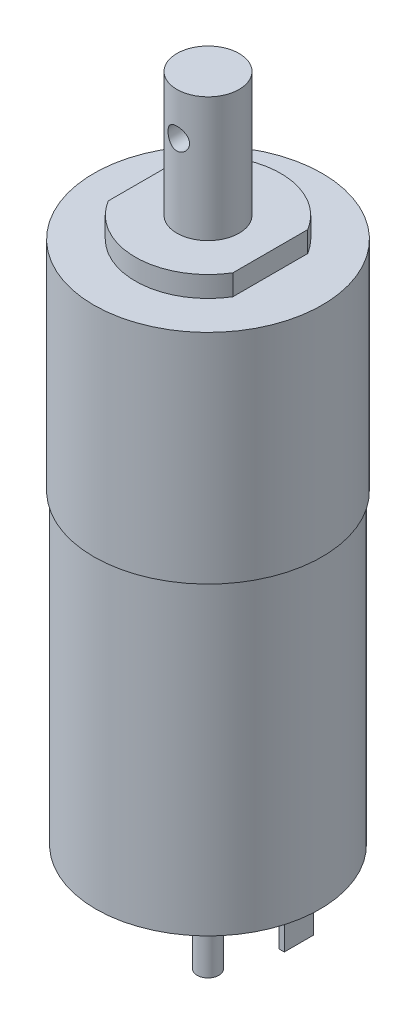
ISO-10303-21;
HEADER;
FILE_DESCRIPTION(('STEP AP214'),'2;1');
FILE_NAME('part.step','',(''),(''),'','','');
FILE_SCHEMA(('AUTOMOTIVE_DESIGN { 1 0 10303 214 1 1 1 1 }'));
ENDSEC;
DATA;
#1=APPLICATION_CONTEXT('core data for automotive mechanical design processes');
#2=APPLICATION_PROTOCOL_DEFINITION('international standard','automotive_design',2000,#1);
#3=PRODUCT_CONTEXT('',#1,'mechanical');
#4=PRODUCT('Part','Part','',(#3));
#5=PRODUCT_RELATED_PRODUCT_CATEGORY('part','',(#4));
#6=PRODUCT_DEFINITION_FORMATION('','',#4);
#7=PRODUCT_DEFINITION_CONTEXT('part definition',#1,'design');
#8=PRODUCT_DEFINITION('design','',#6,#7);
#9=PRODUCT_DEFINITION_SHAPE('','',#8);
#10=(LENGTH_UNIT() NAMED_UNIT(*) SI_UNIT(.MILLI.,.METRE.));
#11=(NAMED_UNIT(*) PLANE_ANGLE_UNIT() SI_UNIT($,.RADIAN.));
#12=(NAMED_UNIT(*) SI_UNIT($,.STERADIAN.) SOLID_ANGLE_UNIT());
#13=UNCERTAINTY_MEASURE_WITH_UNIT(LENGTH_MEASURE(1.E-05),#10,'distance_accuracy_value','');
#14=(GEOMETRIC_REPRESENTATION_CONTEXT(3) GLOBAL_UNCERTAINTY_ASSIGNED_CONTEXT((#13)) GLOBAL_UNIT_ASSIGNED_CONTEXT((#10,
#11,#12)) REPRESENTATION_CONTEXT('',''));
#15=CARTESIAN_POINT('',(0.,0.,0.));
#16=DIRECTION('',(0.,0.,1.));
#17=DIRECTION('',(1.,0.,0.));
#18=AXIS2_PLACEMENT_3D('',#15,#16,#17);
#19=CARTESIAN_POINT('',(0.,0.,0.));
#20=DIRECTION('',(0.,1.,0.));
#21=DIRECTION('',(0.,0.,1.));
#22=AXIS2_PLACEMENT_3D('',#19,#20,#21);
#23=PLANE('',#22);
#24=DIRECTION('',(0.,0.,-1.));
#25=VECTOR('',#24,1.);
#26=CARTESIAN_POINT('',(-8.75,0.,1.4));
#27=LINE('',#26,#25);
#28=CARTESIAN_POINT('',(-8.75,0.,1.4));
#29=VERTEX_POINT('',#28);
#30=CARTESIAN_POINT('',(-8.75,0.,-1.4));
#31=VERTEX_POINT('',#30);
#32=EDGE_CURVE('E159',#29,#31,#27,.T.);
#33=ORIENTED_EDGE('',*,*,#32,.F.);
#34=DIRECTION('',(-1.,0.,0.));
#35=VECTOR('',#34,1.);
#36=CARTESIAN_POINT('',(-8.75,0.,1.4));
#37=LINE('',#36,#35);
#38=CARTESIAN_POINT('',(-8.25,0.,1.4));
#39=VERTEX_POINT('',#38);
#40=EDGE_CURVE('E175',#39,#29,#37,.T.);
#41=ORIENTED_EDGE('',*,*,#40,.F.);
#42=DIRECTION('',(0.,0.,1.));
#43=VECTOR('',#42,1.);
#44=CARTESIAN_POINT('',(-8.25,0.,1.4));
#45=LINE('',#44,#43);
#46=CARTESIAN_POINT('',(-8.25,0.,-1.4));
#47=VERTEX_POINT('',#46);
#48=EDGE_CURVE('E188',#47,#39,#45,.T.);
#49=ORIENTED_EDGE('',*,*,#48,.F.);
#50=DIRECTION('',(1.,0.,0.));
#51=VECTOR('',#50,1.);
#52=CARTESIAN_POINT('',(-8.75,0.,-1.4));
#53=LINE('',#52,#51);
#54=EDGE_CURVE('E164',#31,#47,#53,.T.);
#55=ORIENTED_EDGE('',*,*,#54,.F.);
#56=EDGE_LOOP('',(#33,#41,#49,#55));
#57=FACE_BOUND('',#56,.T.);
#58=CARTESIAN_POINT('',(0.,0.,0.));
#59=DIRECTION('',(0.,-1.,0.));
#60=DIRECTION('',(0.,0.,-1.));
#61=AXIS2_PLACEMENT_3D('',#58,#59,#60);
#62=CIRCLE('',#61,3.75);
#63=CARTESIAN_POINT('',(0.,0.,-3.75));
#64=VERTEX_POINT('',#63);
#65=EDGE_CURVE('E53',#64,#64,#62,.T.);
#66=ORIENTED_EDGE('',*,*,#65,.F.);
#67=EDGE_LOOP('',(#66));
#68=FACE_BOUND('',#67,.T.);
#69=CARTESIAN_POINT('',(0.,0.,0.));
#70=DIRECTION('',(0.,1.,0.));
#71=DIRECTION('',(0.,0.,1.));
#72=AXIS2_PLACEMENT_3D('',#69,#70,#71);
#73=CIRCLE('',#72,10.8);
#74=CARTESIAN_POINT('',(0.,0.,10.8));
#75=VERTEX_POINT('',#74);
#76=EDGE_CURVE('E276',#75,#75,#73,.T.);
#77=ORIENTED_EDGE('',*,*,#76,.F.);
#78=EDGE_LOOP('',(#77));
#79=FACE_BOUND('',#78,.T.);
#80=DIRECTION('',(0.,0.,-1.));
#81=VECTOR('',#80,1.);
#82=CARTESIAN_POINT('',(8.25,0.,1.4));
#83=LINE('',#82,#81);
#84=CARTESIAN_POINT('',(8.25,0.,1.4));
#85=VERTEX_POINT('',#84);
#86=CARTESIAN_POINT('',(8.25,0.,-1.4));
#87=VERTEX_POINT('',#86);
#88=EDGE_CURVE('E157',#85,#87,#83,.T.);
#89=ORIENTED_EDGE('',*,*,#88,.F.);
#90=DIRECTION('',(-1.,0.,0.));
#91=VECTOR('',#90,1.);
#92=CARTESIAN_POINT('',(8.25,0.,1.4));
#93=LINE('',#92,#91);
#94=CARTESIAN_POINT('',(8.75,0.,1.4));
#95=VERTEX_POINT('',#94);
#96=EDGE_CURVE('E154',#95,#85,#93,.T.);
#97=ORIENTED_EDGE('',*,*,#96,.F.);
#98=DIRECTION('',(0.,0.,1.));
#99=VECTOR('',#98,1.);
#100=CARTESIAN_POINT('',(8.75,0.,1.4));
#101=LINE('',#100,#99);
#102=CARTESIAN_POINT('',(8.75,0.,-1.4));
#103=VERTEX_POINT('',#102);
#104=EDGE_CURVE('E66',#103,#95,#101,.T.);
#105=ORIENTED_EDGE('',*,*,#104,.F.);
#106=DIRECTION('',(1.,0.,0.));
#107=VECTOR('',#106,1.);
#108=CARTESIAN_POINT('',(8.25,0.,-1.4));
#109=LINE('',#108,#107);
#110=EDGE_CURVE('E61',#87,#103,#109,.T.);
#111=ORIENTED_EDGE('',*,*,#110,.F.);
#112=EDGE_LOOP('',(#89,#97,#105,#111));
#113=FACE_BOUND('',#112,.T.);
#114=ADVANCED_FACE('F38',(#57,#68,#79,#113),#23,.F.);
#115=CARTESIAN_POINT('',(0.,29.5,0.));
#116=DIRECTION('',(0.,-1.,0.));
#117=DIRECTION('',(0.,0.,-1.));
#118=AXIS2_PLACEMENT_3D('',#115,#116,#117);
#119=CYLINDRICAL_SURFACE('',#118,10.8);
#120=CARTESIAN_POINT('',(0.,29.5,0.));
#121=DIRECTION('',(0.,1.,0.));
#122=DIRECTION('',(0.,0.,1.));
#123=AXIS2_PLACEMENT_3D('',#120,#121,#122);
#124=CIRCLE('',#123,10.8);
#125=CARTESIAN_POINT('',(0.,29.5,10.8));
#126=VERTEX_POINT('',#125);
#127=EDGE_CURVE('E226',#126,#126,#124,.T.);
#128=ORIENTED_EDGE('',*,*,#127,.F.);
#129=EDGE_LOOP('',(#128));
#130=FACE_BOUND('',#129,.T.);
#131=ORIENTED_EDGE('',*,*,#76,.T.);
#132=EDGE_LOOP('',(#131));
#133=FACE_BOUND('',#132,.T.);
#134=ADVANCED_FACE('F40',(#130,#133),#119,.T.);
#135=CARTESIAN_POINT('',(0.,50.5,0.));
#136=DIRECTION('',(0.,-1.,0.));
#137=DIRECTION('',(0.,0.,-1.));
#138=AXIS2_PLACEMENT_3D('',#135,#136,#137);
#139=CYLINDRICAL_SURFACE('',#138,11.);
#140=CARTESIAN_POINT('',(0.,50.5,0.));
#141=DIRECTION('',(0.,1.,0.));
#142=DIRECTION('',(0.,0.,1.));
#143=AXIS2_PLACEMENT_3D('',#140,#141,#142);
#144=CIRCLE('',#143,11.);
#145=CARTESIAN_POINT('',(0.,50.5,-11.));
#146=VERTEX_POINT('',#145);
#147=EDGE_CURVE('E272',#146,#146,#144,.T.);
#148=CARTESIAN_POINT('',(0.,29.5,0.));
#149=DIRECTION('',(0.,1.,0.));
#150=DIRECTION('',(0.,0.,1.));
#151=AXIS2_PLACEMENT_3D('',#148,#149,#150);
#152=CIRCLE('',#151,11.);
#153=CARTESIAN_POINT('',(0.,29.5,-11.));
#154=VERTEX_POINT('',#153);
#155=EDGE_CURVE('E271',#154,#154,#152,.T.);
#156=CARTESIAN_POINT('',(0.,50.5,-11.));
#157=CARTESIAN_POINT('',(0.,50.28125,-11.));
#158=CARTESIAN_POINT('',(0.,50.0625,-11.));
#159=CARTESIAN_POINT('',(0.,49.625,-11.));
#160=CARTESIAN_POINT('',(0.,49.40625,-11.));
#161=CARTESIAN_POINT('',(0.,48.96875,-11.));
#162=CARTESIAN_POINT('',(0.,48.75,-11.));
#163=CARTESIAN_POINT('',(0.,48.3125,-11.));
#164=CARTESIAN_POINT('',(0.,48.09375,-11.));
#165=CARTESIAN_POINT('',(0.,47.65625,-11.));
#166=CARTESIAN_POINT('',(0.,47.4375,-11.));
#167=CARTESIAN_POINT('',(0.,47.,-11.));
#168=CARTESIAN_POINT('',(0.,46.78125,-11.));
#169=CARTESIAN_POINT('',(0.,46.34375,-11.));
#170=CARTESIAN_POINT('',(0.,46.125,-11.));
#171=CARTESIAN_POINT('',(0.,45.6875,-11.));
#172=CARTESIAN_POINT('',(0.,45.46875,-11.));
#173=CARTESIAN_POINT('',(0.,45.03125,-11.));
#174=CARTESIAN_POINT('',(0.,44.8125,-11.));
#175=CARTESIAN_POINT('',(0.,44.375,-11.));
#176=CARTESIAN_POINT('',(0.,44.15625,-11.));
#177=CARTESIAN_POINT('',(0.,43.71875,-11.));
#178=CARTESIAN_POINT('',(0.,43.5,-11.));
#179=CARTESIAN_POINT('',(0.,43.0625,-11.));
#180=CARTESIAN_POINT('',(0.,42.84375,-11.));
#181=CARTESIAN_POINT('',(0.,42.40625,-11.));
#182=CARTESIAN_POINT('',(0.,42.1875,-11.));
#183=CARTESIAN_POINT('',(0.,41.75,-11.));
#184=CARTESIAN_POINT('',(0.,41.53125,-11.));
#185=CARTESIAN_POINT('',(0.,41.09375,-11.));
#186=CARTESIAN_POINT('',(0.,40.875,-11.));
#187=CARTESIAN_POINT('',(0.,40.4375,-11.));
#188=CARTESIAN_POINT('',(0.,40.21875,-11.));
#189=CARTESIAN_POINT('',(0.,39.78125,-11.));
#190=CARTESIAN_POINT('',(0.,39.5625,-11.));
#191=CARTESIAN_POINT('',(0.,39.125,-11.));
#192=CARTESIAN_POINT('',(0.,38.90625,-11.));
#193=CARTESIAN_POINT('',(0.,38.46875,-11.));
#194=CARTESIAN_POINT('',(0.,38.25,-11.));
#195=CARTESIAN_POINT('',(0.,37.8125,-11.));
#196=CARTESIAN_POINT('',(0.,37.59375,-11.));
#197=CARTESIAN_POINT('',(0.,37.15625,-11.));
#198=CARTESIAN_POINT('',(0.,36.9375,-11.));
#199=CARTESIAN_POINT('',(0.,36.5,-11.));
#200=CARTESIAN_POINT('',(0.,36.28125,-11.));
#201=CARTESIAN_POINT('',(0.,35.84375,-11.));
#202=CARTESIAN_POINT('',(0.,35.625,-11.));
#203=CARTESIAN_POINT('',(0.,35.1875,-11.));
#204=CARTESIAN_POINT('',(0.,34.96875,-11.));
#205=CARTESIAN_POINT('',(0.,34.53125,-11.));
#206=CARTESIAN_POINT('',(0.,34.3125,-11.));
#207=CARTESIAN_POINT('',(0.,33.875,-11.));
#208=CARTESIAN_POINT('',(0.,33.65625,-11.));
#209=CARTESIAN_POINT('',(0.,33.21875,-11.));
#210=CARTESIAN_POINT('',(0.,33.,-11.));
#211=CARTESIAN_POINT('',(0.,32.5625,-11.));
#212=CARTESIAN_POINT('',(0.,32.34375,-11.));
#213=CARTESIAN_POINT('',(0.,31.90625,-11.));
#214=CARTESIAN_POINT('',(0.,31.6875,-11.));
#215=CARTESIAN_POINT('',(0.,31.25,-11.));
#216=CARTESIAN_POINT('',(0.,31.03125,-11.));
#217=CARTESIAN_POINT('',(0.,30.59375,-11.));
#218=CARTESIAN_POINT('',(0.,30.375,-11.));
#219=CARTESIAN_POINT('',(0.,29.9375,-11.));
#220=CARTESIAN_POINT('',(0.,29.71875,-11.));
#221=CARTESIAN_POINT('',(0.,29.5,-11.));
#222=B_SPLINE_CURVE_WITH_KNOTS('',3,(#156,#157,#158,#159,#160,#161,#162,#163,#164,#165,#166,
#167,#168,#169,#170,#171,#172,#173,#174,#175,#176,#177,#178,#179,#180,#181,#182,#183,#184,#185,
#186,#187,#188,#189,#190,#191,#192,#193,#194,#195,#196,#197,#198,#199,#200,#201,#202,#203,#204,
#205,#206,#207,#208,#209,#210,#211,#212,#213,#214,#215,#216,#217,#218,#219,#220,#221),
.UNSPECIFIED.,.F.,.F.,(4,2,2,2,2,2,2,2,2,2,2,2,2,2,2,2,2,2,2,2,2,2,2,2,2,2,2,2,2,2,2,2,4),(0.,
0.656249999999997,1.31249999999999,1.96875,2.625,3.28125,3.9375,4.59375,5.25,5.90624999999999,
6.5625,7.21875,7.875,8.53125,9.18749999999999,9.84375,10.5,11.15625,11.8125,12.46875,13.125,
13.78125,14.4375,15.09375,15.75,16.40625,17.0625,17.71875,18.375,19.03125,19.6875,20.34375,21.),.UNSPECIFIED.);
#223=EDGE_CURVE('BSEAM364',#146,#154,#222,.T.);
#224=ORIENTED_EDGE('',*,*,#147,.F.);
#225=ORIENTED_EDGE('',*,*,#155,.T.);
#226=ORIENTED_EDGE('',*,*,#223,.T.);
#227=ORIENTED_EDGE('',*,*,#223,.F.);
#228=EDGE_LOOP('',(#224,#226,#225,#227));
#229=FACE_BOUND('',#228,.T.);
#230=ADVANCED_FACE('F364',(#229),#139,.T.);
#231=CARTESIAN_POINT('',(0.,50.5,0.));
#232=DIRECTION('',(0.,1.,0.));
#233=DIRECTION('',(0.,0.,1.));
#234=AXIS2_PLACEMENT_3D('',#231,#232,#233);
#235=PLANE('',#234);
#236=CARTESIAN_POINT('',(0.,50.5,0.));
#237=DIRECTION('',(0.,1.,0.));
#238=DIRECTION('',(0.,0.,1.));
#239=AXIS2_PLACEMENT_3D('',#236,#237,#238);
#240=CIRCLE('',#239,7.);
#241=CARTESIAN_POINT('',(6.,50.5,-3.60555127546399));
#242=VERTEX_POINT('',#241);
#243=CARTESIAN_POINT('',(-6.,50.5,-3.60555127546399));
#244=VERTEX_POINT('',#243);
#245=EDGE_CURVE('E222',#242,#244,#240,.T.);
#246=ORIENTED_EDGE('',*,*,#245,.F.);
#247=DIRECTION('',(0.,0.,-1.));
#248=VECTOR('',#247,1.);
#249=CARTESIAN_POINT('',(6.,50.5,-3.60555127546399));
#250=LINE('',#249,#248);
#251=CARTESIAN_POINT('',(6.,50.5,3.60555127546399));
#252=VERTEX_POINT('',#251);
#253=EDGE_CURVE('E232',#252,#242,#250,.T.);
#254=ORIENTED_EDGE('',*,*,#253,.F.);
#255=CARTESIAN_POINT('',(0.,50.5,0.));
#256=DIRECTION('',(0.,1.,0.));
#257=DIRECTION('',(0.,0.,1.));
#258=AXIS2_PLACEMENT_3D('',#255,#256,#257);
#259=CIRCLE('',#258,7.);
#260=CARTESIAN_POINT('',(-6.,50.5,3.60555127546399));
#261=VERTEX_POINT('',#260);
#262=EDGE_CURVE('E249',#261,#252,#259,.T.);
#263=ORIENTED_EDGE('',*,*,#262,.F.);
#264=DIRECTION('',(0.,0.,1.));
#265=VECTOR('',#264,1.);
#266=CARTESIAN_POINT('',(-6.,50.5,-3.60555127546399));
#267=LINE('',#266,#265);
#268=EDGE_CURVE('E245',#244,#261,#267,.T.);
#269=ORIENTED_EDGE('',*,*,#268,.F.);
#270=EDGE_LOOP('',(#246,#254,#263,#269));
#271=FACE_BOUND('',#270,.T.);
#272=ORIENTED_EDGE('',*,*,#147,.T.);
#273=EDGE_LOOP('',(#272));
#274=FACE_BOUND('',#273,.T.);
#275=ADVANCED_FACE('F370',(#271,#274),#235,.T.);
#276=CARTESIAN_POINT('',(0.,29.5,0.));
#277=DIRECTION('',(0.,1.,0.));
#278=DIRECTION('',(0.,0.,1.));
#279=AXIS2_PLACEMENT_3D('',#276,#277,#278);
#280=PLANE('',#279);
#281=ORIENTED_EDGE('',*,*,#127,.T.);
#282=EDGE_LOOP('',(#281));
#283=FACE_BOUND('',#282,.T.);
#284=ORIENTED_EDGE('',*,*,#155,.F.);
#285=EDGE_LOOP('',(#284));
#286=FACE_BOUND('',#285,.T.);
#287=ADVANCED_FACE('F372',(#283,#286),#280,.F.);
#288=CARTESIAN_POINT('',(0.,52.5,0.));
#289=DIRECTION('',(0.,-1.,0.));
#290=DIRECTION('',(0.,0.,-1.));
#291=AXIS2_PLACEMENT_3D('',#288,#289,#290);
#292=CYLINDRICAL_SURFACE('',#291,7.);
#293=ORIENTED_EDGE('',*,*,#245,.T.);
#294=DIRECTION('',(0.,-1.,0.));
#295=VECTOR('',#294,1.);
#296=CARTESIAN_POINT('',(-6.,52.5,-3.60555127546399));
#297=LINE('',#296,#295);
#298=CARTESIAN_POINT('',(-6.,52.5,-3.60555127546399));
#299=VERTEX_POINT('',#298);
#300=EDGE_CURVE('E267',#299,#244,#297,.T.);
#301=ORIENTED_EDGE('',*,*,#300,.F.);
#302=CARTESIAN_POINT('',(0.,52.5,0.));
#303=DIRECTION('',(0.,1.,0.));
#304=DIRECTION('',(0.,0.,1.));
#305=AXIS2_PLACEMENT_3D('',#302,#303,#304);
#306=CIRCLE('',#305,7.);
#307=CARTESIAN_POINT('',(6.,52.5,-3.60555127546399));
#308=VERTEX_POINT('',#307);
#309=EDGE_CURVE('E227',#308,#299,#306,.T.);
#310=ORIENTED_EDGE('',*,*,#309,.F.);
#311=DIRECTION('',(0.,-1.,0.));
#312=VECTOR('',#311,1.);
#313=CARTESIAN_POINT('',(6.,52.5,-3.60555127546399));
#314=LINE('',#313,#312);
#315=EDGE_CURVE('E241',#308,#242,#314,.T.);
#316=ORIENTED_EDGE('',*,*,#315,.T.);
#317=EDGE_LOOP('',(#293,#301,#310,#316));
#318=FACE_BOUND('',#317,.T.);
#319=ADVANCED_FACE('F375',(#318),#292,.T.);
#320=CARTESIAN_POINT('',(-6.,52.5,-3.60555127546399));
#321=DIRECTION('',(1.,0.,0.));
#322=DIRECTION('',(0.,0.,-1.));
#323=AXIS2_PLACEMENT_3D('',#320,#321,#322);
#324=PLANE('',#323);
#325=ORIENTED_EDGE('',*,*,#268,.T.);
#326=DIRECTION('',(0.,-1.,0.));
#327=VECTOR('',#326,1.);
#328=CARTESIAN_POINT('',(-6.,52.5,3.60555127546399));
#329=LINE('',#328,#327);
#330=CARTESIAN_POINT('',(-6.,52.5,3.60555127546399));
#331=VERTEX_POINT('',#330);
#332=EDGE_CURVE('E263',#331,#261,#329,.T.);
#333=ORIENTED_EDGE('',*,*,#332,.F.);
#334=DIRECTION('',(0.,0.,1.));
#335=VECTOR('',#334,1.);
#336=CARTESIAN_POINT('',(-6.,52.5,-3.60555127546399));
#337=LINE('',#336,#335);
#338=EDGE_CURVE('E231',#299,#331,#337,.T.);
#339=ORIENTED_EDGE('',*,*,#338,.F.);
#340=ORIENTED_EDGE('',*,*,#300,.T.);
#341=EDGE_LOOP('',(#325,#333,#339,#340));
#342=FACE_BOUND('',#341,.T.);
#343=ADVANCED_FACE('F382',(#342),#324,.F.);
#344=CARTESIAN_POINT('',(0.,52.5,0.));
#345=DIRECTION('',(0.,-1.,0.));
#346=DIRECTION('',(0.,0.,-1.));
#347=AXIS2_PLACEMENT_3D('',#344,#345,#346);
#348=CYLINDRICAL_SURFACE('',#347,7.);
#349=ORIENTED_EDGE('',*,*,#262,.T.);
#350=DIRECTION('',(0.,-1.,0.));
#351=VECTOR('',#350,1.);
#352=CARTESIAN_POINT('',(6.,52.5,3.60555127546399));
#353=LINE('',#352,#351);
#354=CARTESIAN_POINT('',(6.,52.5,3.60555127546399));
#355=VERTEX_POINT('',#354);
#356=EDGE_CURVE('E259',#355,#252,#353,.T.);
#357=ORIENTED_EDGE('',*,*,#356,.F.);
#358=CARTESIAN_POINT('',(0.,52.5,0.));
#359=DIRECTION('',(0.,1.,0.));
#360=DIRECTION('',(0.,0.,1.));
#361=AXIS2_PLACEMENT_3D('',#358,#359,#360);
#362=CIRCLE('',#361,7.);
#363=EDGE_CURVE('E235',#331,#355,#362,.T.);
#364=ORIENTED_EDGE('',*,*,#363,.F.);
#365=ORIENTED_EDGE('',*,*,#332,.T.);
#366=EDGE_LOOP('',(#349,#357,#364,#365));
#367=FACE_BOUND('',#366,.T.);
#368=ADVANCED_FACE('F386',(#367),#348,.T.);
#369=CARTESIAN_POINT('',(6.,52.5,-3.60555127546399));
#370=DIRECTION('',(-1.,0.,0.));
#371=DIRECTION('',(0.,0.,1.));
#372=AXIS2_PLACEMENT_3D('',#369,#370,#371);
#373=PLANE('',#372);
#374=ORIENTED_EDGE('',*,*,#253,.T.);
#375=ORIENTED_EDGE('',*,*,#315,.F.);
#376=DIRECTION('',(0.,0.,-1.));
#377=VECTOR('',#376,1.);
#378=CARTESIAN_POINT('',(6.,52.5,-3.60555127546399));
#379=LINE('',#378,#377);
#380=EDGE_CURVE('E238',#355,#308,#379,.T.);
#381=ORIENTED_EDGE('',*,*,#380,.F.);
#382=ORIENTED_EDGE('',*,*,#356,.T.);
#383=EDGE_LOOP('',(#374,#375,#381,#382));
#384=FACE_BOUND('',#383,.T.);
#385=ADVANCED_FACE('F390',(#384),#373,.F.);
#386=CARTESIAN_POINT('',(0.,52.5,0.));
#387=DIRECTION('',(0.,1.,0.));
#388=DIRECTION('',(0.,0.,1.));
#389=AXIS2_PLACEMENT_3D('',#386,#387,#388);
#390=PLANE('',#389);
#391=CARTESIAN_POINT('',(0.,52.5,0.));
#392=DIRECTION('',(0.,1.,0.));
#393=DIRECTION('',(0.,0.,1.));
#394=AXIS2_PLACEMENT_3D('',#391,#392,#393);
#395=CIRCLE('',#394,3.);
#396=CARTESIAN_POINT('',(0.,52.5,3.));
#397=VERTEX_POINT('',#396);
#398=EDGE_CURVE('E218',#397,#397,#395,.T.);
#399=ORIENTED_EDGE('',*,*,#398,.F.);
#400=EDGE_LOOP('',(#399));
#401=FACE_BOUND('',#400,.T.);
#402=ORIENTED_EDGE('',*,*,#309,.T.);
#403=ORIENTED_EDGE('',*,*,#338,.T.);
#404=ORIENTED_EDGE('',*,*,#363,.T.);
#405=ORIENTED_EDGE('',*,*,#380,.T.);
#406=EDGE_LOOP('',(#402,#403,#404,#405));
#407=FACE_BOUND('',#406,.T.);
#408=ADVANCED_FACE('F357',(#401,#407),#390,.T.);
#409=CARTESIAN_POINT('',(0.,64.5,0.));
#410=DIRECTION('',(0.,-1.,0.));
#411=DIRECTION('',(0.,0.,-1.));
#412=AXIS2_PLACEMENT_3D('',#409,#410,#411);
#413=CYLINDRICAL_SURFACE('',#412,3.);
#414=CARTESIAN_POINT('',(0.,61.4375,-3.));
#415=CARTESIAN_POINT('',(-0.0564873121474209,61.4375007134293,-3.00000049152204));
#416=CARTESIAN_POINT('',(-0.112969558238451,61.432871912521,-2.99839011162871));
#417=CARTESIAN_POINT('',(-0.224263129842658,61.414540872955,-2.99212523468374));
#418=CARTESIAN_POINT('',(-0.279074406276555,61.400838368055,-2.98747064830844));
#419=CARTESIAN_POINT('',(-0.38540552337415,61.3648908675574,-2.97562137013223));
#420=CARTESIAN_POINT('',(-0.436930933402395,61.3426608001337,-2.96843111897833));
#421=CARTESIAN_POINT('',(-0.535521078760414,61.2903591356123,-2.95223920505136));
#422=CARTESIAN_POINT('',(-0.582584829730867,61.2602858135509,-2.94323714390721));
#423=CARTESIAN_POINT('',(-0.672654266472712,61.1919863315108,-2.92399194743247));
#424=CARTESIAN_POINT('',(-0.715472618406546,61.1535220199944,-2.91371746557961));
#425=CARTESIAN_POINT('',(-0.794196428823518,61.0700384347714,-2.89325243011233));
#426=CARTESIAN_POINT('',(-0.830100204978519,61.0250175705117,-2.88306189749874));
#427=CARTESIAN_POINT('',(-0.89507955409342,60.9279711363954,-2.8635680791668));
#428=CARTESIAN_POINT('',(-0.923905565162659,60.8757701195312,-2.85430265954002));
#429=CARTESIAN_POINT('',(-0.972288112366212,60.7668890875414,-2.83818796750325));
#430=CARTESIAN_POINT('',(-0.991847725615791,60.7102105665764,-2.83133789321718));
#431=CARTESIAN_POINT('',(-1.02042872664276,60.5961224588108,-2.82116098897972));
#432=CARTESIAN_POINT('',(-1.02980317303395,60.5388121361846,-2.8177165212732));
#433=CARTESIAN_POINT('',(-1.03885166584973,60.4233364352265,-2.81439384306047));
#434=CARTESIAN_POINT('',(-1.03852898632616,60.3651713521178,-2.81451442888089));
#435=CARTESIAN_POINT('',(-1.02846528638601,60.2527086285351,-2.81820561746982));
#436=CARTESIAN_POINT('',(-1.01919297773322,60.1983624133568,-2.82160452131548));
#437=CARTESIAN_POINT('',(-0.992260802979309,60.0920508047026,-2.83118715140992));
#438=CARTESIAN_POINT('',(-0.974599860226957,60.040085717775,-2.8373712351213));
#439=CARTESIAN_POINT('',(-0.93109961825088,59.9389786020235,-2.85194414921652));
#440=CARTESIAN_POINT('',(-0.905126541342612,59.8898994920484,-2.86036863351766));
#441=CARTESIAN_POINT('',(-0.845832233071534,59.7966516445114,-2.87845906638967));
#442=CARTESIAN_POINT('',(-0.812508752134275,59.7524844164578,-2.88812539464506));
#443=CARTESIAN_POINT('',(-0.73723929014624,59.6676911022661,-2.90827738941347));
#444=CARTESIAN_POINT('',(-0.694912634912798,59.6274058724061,-2.91877849794929));
#445=CARTESIAN_POINT('',(-0.60397690222516,59.5544127501358,-2.93894170446321));
#446=CARTESIAN_POINT('',(-0.555367127476354,59.5217056998714,-2.94860370911908));
#447=CARTESIAN_POINT('',(-0.45248012551519,59.4644946087316,-2.96614431387168));
#448=CARTESIAN_POINT('',(-0.39814464670009,59.440088254212,-2.97400134507224));
#449=CARTESIAN_POINT('',(-0.285801564317194,59.4008705050714,-2.98688932545189));
#450=CARTESIAN_POINT('',(-0.227795347191555,59.3860555112472,-2.99192133463945));
#451=CARTESIAN_POINT('',(-0.11263813429644,59.3670596339795,-2.99841358019482));
#452=CARTESIAN_POINT('',(-0.0555716465899201,59.3624186477858,-3.00002823565212));
#453=CARTESIAN_POINT('',(0.0585400519706586,59.3625834753326,-2.99997103012172));
#454=CARTESIAN_POINT('',(0.115585264807485,59.3673875551021,-2.9982997723779));
#455=CARTESIAN_POINT('',(0.226151435378778,59.3859458502778,-2.99196056703654));
#456=CARTESIAN_POINT('',(0.279726794326627,59.3994121997241,-2.98738906566194));
#457=CARTESIAN_POINT('',(0.38383184358442,59.4345473799445,-2.97580554251684));
#458=CARTESIAN_POINT('',(0.434361139917516,59.4562172691345,-2.96879320584058));
#459=CARTESIAN_POINT('',(0.532482315734629,59.5077977094064,-2.9527957397578));
#460=CARTESIAN_POINT('',(0.57995607209829,59.5379174178284,-2.94376190327909));
#461=CARTESIAN_POINT('',(0.669321953818768,59.6052997312027,-2.9247391333007));
#462=CARTESIAN_POINT('',(0.711212254937572,59.6425646610064,-2.91474988947036));
#463=CARTESIAN_POINT('',(0.790365457432199,59.7253400861232,-2.89431788301679));
#464=CARTESIAN_POINT('',(0.827300263940126,59.771165547554,-2.88387692875584));
#465=CARTESIAN_POINT('',(0.893003287580368,59.8685841817716,-2.86421455371673));
#466=CARTESIAN_POINT('',(0.921771278311851,59.9201775144002,-2.85499316675125));
#467=CARTESIAN_POINT('',(0.97022876754099,60.0277891357061,-2.83889266126015));
#468=CARTESIAN_POINT('',(0.989923184699964,60.0838050076473,-2.8320122742404));
#469=CARTESIAN_POINT('',(1.01949888953601,60.198654722114,-2.82150193575973));
#470=CARTESIAN_POINT('',(1.02938505321079,60.2574871491753,-2.81787036929414));
#471=CARTESIAN_POINT('',(1.03866602138374,60.3728061480628,-2.8144617373595));
#472=CARTESIAN_POINT('',(1.03860958639898,60.4292430517843,-2.81448305676361));
#473=CARTESIAN_POINT('',(1.02937361970918,60.5412575620786,-2.81787395068273));
#474=CARTESIAN_POINT('',(1.02019471358275,60.5968352273087,-2.82124329560499));
#475=CARTESIAN_POINT('',(0.993374923543808,60.7043271690416,-2.83079506104231));
#476=CARTESIAN_POINT('',(0.975924919751634,60.7562951780961,-2.83691387160482));
#477=CARTESIAN_POINT('',(0.933216392550777,60.8566036166186,-2.85124747018448));
#478=CARTESIAN_POINT('',(0.907956056674316,60.904943200834,-2.85946274463024));
#479=CARTESIAN_POINT('',(0.848980476406574,60.9990519722052,-2.87753784041365));
#480=CARTESIAN_POINT('',(0.814927757293846,61.0445983372757,-2.88745621679224));
#481=CARTESIAN_POINT('',(0.739890322762006,61.1295070949368,-2.90758828146906));
#482=CARTESIAN_POINT('',(0.698903577394041,61.1688676700984,-2.91780205551746));
#483=CARTESIAN_POINT('',(0.609040242595177,61.2420059490256,-2.93790340330063));
#484=CARTESIAN_POINT('',(0.559899491506543,61.2754694056553,-2.94775787618091));
#485=CARTESIAN_POINT('',(0.456358300464889,61.3336312274947,-2.9655508509335));
#486=CARTESIAN_POINT('',(0.401958727251847,61.3583310339741,-2.97348966778577));
#487=CARTESIAN_POINT('',(0.290511102512186,61.3977139361695,-2.98641694638796));
#488=CARTESIAN_POINT('',(0.233535253717017,61.4125827225487,-2.99145985041962));
#489=CARTESIAN_POINT('',(0.117704017151186,61.4324737501009,-2.99825057480846));
#490=CARTESIAN_POINT('',(0.0588492592877879,61.4374992567396,-2.99999948792558));
#491=CARTESIAN_POINT('',(0.,61.4375,-3.));
#492=B_SPLINE_CURVE_WITH_KNOTS('',3,(#414,#415,#416,#417,#418,#419,#420,#421,#422,#423,#424,
#425,#426,#427,#428,#429,#430,#431,#432,#433,#434,#435,#436,#437,#438,#439,#440,#441,#442,#443,
#444,#445,#446,#447,#448,#449,#450,#451,#452,#453,#454,#455,#456,#457,#458,#459,#460,#461,#462,
#463,#464,#465,#466,#467,#468,#469,#470,#471,#472,#473,#474,#475,#476,#477,#478,#479,#480,#481,
#482,#483,#484,#485,#486,#487,#488,#489,#490,#491),.UNSPECIFIED.,.T.,.F.,(4,2,2,2,2,2,2,2,2,2,2,
2,2,2,2,2,2,2,2,2,2,2,2,2,2,2,2,2,2,2,2,2,2,2,2,2,2,2,4),(0.,0.169245222305312,
0.338495410856446,0.507450655758719,0.676443090300203,0.851063248832356,1.02572583922308,
1.2058681543937,1.38595060726411,1.55956918553393,1.73312914542099,1.89806642277214,
2.06302487495644,2.23078434781631,2.39859523449487,2.57588328426793,2.75319102621993,
2.93251851982623,3.11177868088529,3.28274873013624,3.45368739480807,3.61921988102844,
3.78477373143824,3.95485512303871,4.12499194847512,4.3034805451991,4.48197408950886,
4.66037076070766,4.83867870068758,5.00714857536261,5.17560689791764,5.34035393096992,
5.50513922399359,5.67755846271977,5.85002826511686,6.02994128982986,6.20982471232335,
6.38620523781383,6.56252723990646),.UNSPECIFIED.);
#493=CARTESIAN_POINT('',(0.,61.4375,-3.));
#494=VERTEX_POINT('',#493);
#495=EDGE_CURVE('E42',#494,#494,#492,.T.);
#496=ORIENTED_EDGE('',*,*,#495,.T.);
#497=EDGE_LOOP('',(#496));
#498=FACE_BOUND('',#497,.T.);
#499=CARTESIAN_POINT('',(1.0375,60.4,2.81488787520924));
#500=CARTESIAN_POINT('',(1.03750073555548,60.3436269394892,2.81488726797477));
#501=CARTESIAN_POINT('',(1.03288994094725,60.2872589893587,2.81659981208406));
#502=CARTESIAN_POINT('',(1.01463693213587,60.1762017050879,2.82322586986687));
#503=CARTESIAN_POINT('',(1.00099378636748,60.1215125447011,2.82813971371045));
#504=CARTESIAN_POINT('',(0.965219586961304,60.0154414710762,2.84054664091658));
#505=CARTESIAN_POINT('',(0.943106209006146,59.9640529291378,2.84803434982125));
#506=CARTESIAN_POINT('',(0.891080355007065,59.8656972837949,2.86473727591695));
#507=CARTESIAN_POINT('',(0.861165960232023,59.8187312720254,2.87395291795195));
#508=CARTESIAN_POINT('',(0.793036433283006,59.7285740602556,2.89350891469487));
#509=CARTESIAN_POINT('',(0.754547325974656,59.6855962534869,2.9038788232447));
#510=CARTESIAN_POINT('',(0.670944658840744,59.6065583958665,2.92432609769519));
#511=CARTESIAN_POINT('',(0.625829943567219,59.5704995541566,2.93440341220212));
#512=CARTESIAN_POINT('',(0.52867915198397,59.5053379468998,2.95347485038025));
#513=CARTESIAN_POINT('',(0.476483205157905,59.4764611810834,2.96243020047847));
#514=CARTESIAN_POINT('',(0.367611207819667,59.4279835905995,2.97789846266114));
#515=CARTESIAN_POINT('',(0.310936468928736,59.4083800619121,2.98441208662308));
#516=CARTESIAN_POINT('',(0.196954860549268,59.3797361518789,2.99405353127151));
#517=CARTESIAN_POINT('',(0.139750074236486,59.3703296884216,2.99729837325032));
#518=CARTESIAN_POINT('',(0.0244881370704725,59.3611803282569,3.0004533565161));
#519=CARTESIAN_POINT('',(-0.0335687732026401,59.361434754525,3.00036442158995));
#520=CARTESIAN_POINT('',(-0.146286381760178,59.3713732141668,2.99693977885944));
#521=CARTESIAN_POINT('',(-0.200987045362498,59.3806590867068,2.9937411669191));
#522=CARTESIAN_POINT('',(-0.307999471735811,59.4077351553143,2.98463091300027));
#523=CARTESIAN_POINT('',(-0.36031106949064,59.4255259378576,2.9787190839267));
#524=CARTESIAN_POINT('',(-0.461901247925623,59.4693251200949,2.96467787869447));
#525=CARTESIAN_POINT('',(-0.511128777844186,59.4954422077053,2.95651937913116));
#526=CARTESIAN_POINT('',(-0.604616323925557,59.5550613307243,2.93882733417495));
#527=CARTESIAN_POINT('',(-0.648874881809462,59.5885655255731,2.92929338698586));
#528=CARTESIAN_POINT('',(-0.733531218156664,59.6639894524942,2.90928161942754));
#529=CARTESIAN_POINT('',(-0.773621718628129,59.7062483855652,2.89878044616954));
#530=CARTESIAN_POINT('',(-0.846251164053095,59.7969722021387,2.87841713096756));
#531=CARTESIAN_POINT('',(-0.878788752613289,59.8454381979182,2.86855510403385));
#532=CARTESIAN_POINT('',(-0.935858912941644,59.948241919898,2.85045304466012));
#533=CARTESIAN_POINT('',(-0.960251673788689,60.0026628019283,2.84224221767383));
#534=CARTESIAN_POINT('',(-0.999418915519682,60.1151963146657,2.82870930656408));
#535=CARTESIAN_POINT('',(-1.01419780009864,60.1733072417173,2.82338590002595));
#536=CARTESIAN_POINT('',(-1.03307118286887,60.2885759783319,2.81653341577564));
#537=CARTESIAN_POINT('',(-1.03764564843793,60.3456450661444,2.81483406174683));
#538=CARTESIAN_POINT('',(-1.03734734181516,60.459748539441,2.81494427226467));
#539=CARTESIAN_POINT('',(-1.03247645820019,60.516782929582,2.81675313535102));
#540=CARTESIAN_POINT('',(-1.01385826210133,60.6269374510412,2.82350525066306));
#541=CARTESIAN_POINT('',(-1.0004548883741,60.6801239845726,2.82832692532097));
#542=CARTESIAN_POINT('',(-0.965570610143884,60.7834788632997,2.84042458996124));
#543=CARTESIAN_POINT('',(-0.944088206270806,60.8336466462459,2.8477010354935));
#544=CARTESIAN_POINT('',(-0.89283979200028,60.9314045807003,2.86418973076724));
#545=CARTESIAN_POINT('',(-0.862820348507838,60.9788520452654,2.87345867261415));
#546=CARTESIAN_POINT('',(-0.795631968572498,61.0682088646894,2.89278238294243));
#547=CARTESIAN_POINT('',(-0.758460771772364,61.1101164615544,2.90283739926959));
#548=CARTESIAN_POINT('',(-0.675712578523067,61.1894768976459,2.92323771015827));
#549=CARTESIAN_POINT('',(-0.629797099520444,61.2265810788112,2.93357059277903));
#550=CARTESIAN_POINT('',(-0.532136483947192,61.2925859717335,2.95284685316816));
#551=CARTESIAN_POINT('',(-0.480391502940801,61.3214869023275,2.96179026800029));
#552=CARTESIAN_POINT('',(-0.372745997960531,61.3700155547359,2.97724640044478));
#553=CARTESIAN_POINT('',(-0.31687199418528,61.3896973593822,2.9837732459708));
#554=CARTESIAN_POINT('',(-0.202334515193151,61.419294826545,2.99371992474489));
#555=CARTESIAN_POINT('',(-0.143672142448996,61.42921431579,2.99714097539219));
#556=CARTESIAN_POINT('',(-0.0284005531996971,61.4386407943563,3.00039181568685));
#557=CARTESIAN_POINT('',(0.028163436925756,61.4386466285644,3.00039365687998));
#558=CARTESIAN_POINT('',(0.140449076944302,61.4294913794734,2.99723669354689));
#559=CARTESIAN_POINT('',(0.196170803708005,61.4203311379227,2.99407817924566));
#560=CARTESIAN_POINT('',(0.304174772940347,61.3934415118181,2.98502335505736));
#561=CARTESIAN_POINT('',(0.356501132480986,61.3758709668589,2.97917787023374));
#562=CARTESIAN_POINT('',(0.457479341567558,61.3328094119508,2.96535203458426));
#563=CARTESIAN_POINT('',(0.506130509749208,61.3073169377691,2.95737128913004));
#564=CARTESIAN_POINT('',(0.600429159970558,61.2480050181361,2.93970672714676));
#565=CARTESIAN_POINT('',(0.645887988498366,61.2139019247179,2.92996902723471));
#566=CARTESIAN_POINT('',(0.730598398928102,61.1388086814268,2.91000402300834));
#567=CARTESIAN_POINT('',(0.769847916959658,61.0978162509518,2.89977655736945));
#568=CARTESIAN_POINT('',(0.842748803105506,61.0080025137853,2.87945648479041));
#569=CARTESIAN_POINT('',(0.87608666856256,60.958920259813,2.86938861108414));
#570=CARTESIAN_POINT('',(0.934026634637951,60.8555327110692,2.85105628673694));
#571=CARTESIAN_POINT('',(0.958630167871367,60.8012282747047,2.84279154043081));
#572=CARTESIAN_POINT('',(0.997858969694118,60.6899856557475,2.8292583785439));
#573=CARTESIAN_POINT('',(1.01267211313444,60.6331208846908,2.82393389031615));
#574=CARTESIAN_POINT('',(1.03249018202942,60.5175016887436,2.81674968380265));
#575=CARTESIAN_POINT('',(1.03749923345541,60.4587480693449,2.81488850802664));
#576=CARTESIAN_POINT('',(1.0375,60.4,2.81488787520924));
#577=B_SPLINE_CURVE_WITH_KNOTS('',3,(#499,#500,#501,#502,#503,#504,#505,#506,#507,#508,#509,
#510,#511,#512,#513,#514,#515,#516,#517,#518,#519,#520,#521,#522,#523,#524,#525,#526,#527,#528,
#529,#530,#531,#532,#533,#534,#535,#536,#537,#538,#539,#540,#541,#542,#543,#544,#545,#546,#547,
#548,#549,#550,#551,#552,#553,#554,#555,#556,#557,#558,#559,#560,#561,#562,#563,#564,#565,#566,
#567,#568,#569,#570,#571,#572,#573,#574,#575,#576),.UNSPECIFIED.,.T.,.F.,(4,2,2,2,2,2,2,2,2,2,2,
2,2,2,2,2,2,2,2,2,2,2,2,2,2,2,2,2,2,2,2,2,2,2,2,2,2,2,4),(0.,0.16890127612396,0.337819974851469,
0.506388077694369,0.674997680566175,0.850063292233298,1.02515947014166,1.20521599954201,
1.38521999313176,1.55852267421229,1.73177733361592,1.89772471014762,2.06368353161763,
2.23190409090768,2.40017389071709,2.57692996483621,2.75371775726426,2.93340053012796,
3.1130009401322,3.28395789792315,3.45488067676956,3.61931576744311,3.78378139034879,
3.95375759455225,4.12378760933122,4.30273028248567,4.48166818156339,4.65954279475676,
4.83734765510473,5.00620527944403,5.17504739850175,5.34081949364834,5.50662224716625,
5.67883045389891,5.85109578002483,6.030772543266,6.2104198220895,6.38651106681199,
6.56252818903799),.UNSPECIFIED.);
#578=CARTESIAN_POINT('',(1.0375,60.4,2.81488787520924));
#579=VERTEX_POINT('',#578);
#580=EDGE_CURVE('E285',#579,#579,#577,.T.);
#581=ORIENTED_EDGE('',*,*,#580,.T.);
#582=EDGE_LOOP('',(#581));
#583=FACE_BOUND('',#582,.T.);
#584=CARTESIAN_POINT('',(0.,64.5,0.));
#585=DIRECTION('',(0.,1.,0.));
#586=DIRECTION('',(0.,0.,1.));
#587=AXIS2_PLACEMENT_3D('',#584,#585,#586);
#588=CIRCLE('',#587,3.);
#589=CARTESIAN_POINT('',(0.,64.5,3.));
#590=VERTEX_POINT('',#589);
#591=EDGE_CURVE('E214',#590,#590,#588,.T.);
#592=ORIENTED_EDGE('',*,*,#591,.F.);
#593=EDGE_LOOP('',(#592));
#594=FACE_BOUND('',#593,.T.);
#595=ORIENTED_EDGE('',*,*,#398,.T.);
#596=EDGE_LOOP('',(#595));
#597=FACE_BOUND('',#596,.T.);
#598=ADVANCED_FACE('F291',(#498,#583,#594,#597),#413,.T.);
#599=CARTESIAN_POINT('',(0.,64.5,0.));
#600=DIRECTION('',(0.,1.,0.));
#601=DIRECTION('',(0.,0.,1.));
#602=AXIS2_PLACEMENT_3D('',#599,#600,#601);
#603=PLANE('',#602);
#604=ORIENTED_EDGE('',*,*,#591,.T.);
#605=EDGE_LOOP('',(#604));
#606=FACE_BOUND('',#605,.T.);
#607=ADVANCED_FACE('F349',(#606),#603,.T.);
#608=CARTESIAN_POINT('',(0.,-2.,0.));
#609=DIRECTION('',(0.,1.,0.));
#610=DIRECTION('',(0.,0.,1.));
#611=AXIS2_PLACEMENT_3D('',#608,#609,#610);
#612=CYLINDRICAL_SURFACE('',#611,3.75);
#613=CARTESIAN_POINT('',(0.,-2.,0.));
#614=DIRECTION('',(0.,-1.,0.));
#615=DIRECTION('',(0.,0.,-1.));
#616=AXIS2_PLACEMENT_3D('',#613,#614,#615);
#617=CIRCLE('',#616,3.75);
#618=CARTESIAN_POINT('',(0.,-2.,-3.75));
#619=VERTEX_POINT('',#618);
#620=EDGE_CURVE('E210',#619,#619,#617,.T.);
#621=ORIENTED_EDGE('',*,*,#620,.F.);
#622=EDGE_LOOP('',(#621));
#623=FACE_BOUND('',#622,.T.);
#624=ORIENTED_EDGE('',*,*,#65,.T.);
#625=EDGE_LOOP('',(#624));
#626=FACE_BOUND('',#625,.T.);
#627=ADVANCED_FACE('F346',(#623,#626),#612,.T.);
#628=CARTESIAN_POINT('',(0.,-2.,0.));
#629=DIRECTION('',(0.,-1.,0.));
#630=DIRECTION('',(0.,0.,-1.));
#631=AXIS2_PLACEMENT_3D('',#628,#629,#630);
#632=PLANE('',#631);
#633=CARTESIAN_POINT('',(0.,-2.,0.));
#634=DIRECTION('',(0.,-1.,0.));
#635=DIRECTION('',(0.,0.,-1.));
#636=AXIS2_PLACEMENT_3D('',#633,#634,#635);
#637=CIRCLE('',#636,1.05);
#638=CARTESIAN_POINT('',(0.,-2.,-1.05));
#639=VERTEX_POINT('',#638);
#640=EDGE_CURVE('E11',#639,#639,#637,.T.);
#641=ORIENTED_EDGE('',*,*,#640,.F.);
#642=EDGE_LOOP('',(#641));
#643=FACE_BOUND('',#642,.T.);
#644=ORIENTED_EDGE('',*,*,#620,.T.);
#645=EDGE_LOOP('',(#644));
#646=FACE_BOUND('',#645,.T.);
#647=ADVANCED_FACE('F342',(#643,#646),#632,.T.);
#648=CARTESIAN_POINT('',(-8.75,-3.9,1.4));
#649=DIRECTION('',(1.,0.,0.));
#650=DIRECTION('',(0.,0.,-1.));
#651=AXIS2_PLACEMENT_3D('',#648,#649,#650);
#652=PLANE('',#651);
#653=ORIENTED_EDGE('',*,*,#32,.T.);
#654=DIRECTION('',(0.,1.,0.));
#655=VECTOR('',#654,1.);
#656=CARTESIAN_POINT('',(-8.75,-3.9,-1.4));
#657=LINE('',#656,#655);
#658=CARTESIAN_POINT('',(-8.75,-3.9,-1.4));
#659=VERTEX_POINT('',#658);
#660=EDGE_CURVE('E206',#659,#31,#657,.T.);
#661=ORIENTED_EDGE('',*,*,#660,.F.);
#662=DIRECTION('',(0.,0.,-1.));
#663=VECTOR('',#662,1.);
#664=CARTESIAN_POINT('',(-8.75,-3.9,1.4));
#665=LINE('',#664,#663);
#666=CARTESIAN_POINT('',(-8.75,-3.9,1.4));
#667=VERTEX_POINT('',#666);
#668=EDGE_CURVE('E170',#667,#659,#665,.T.);
#669=ORIENTED_EDGE('',*,*,#668,.F.);
#670=DIRECTION('',(0.,1.,0.));
#671=VECTOR('',#670,1.);
#672=CARTESIAN_POINT('',(-8.75,-3.9,1.4));
#673=LINE('',#672,#671);
#674=EDGE_CURVE('E183',#667,#29,#673,.T.);
#675=ORIENTED_EDGE('',*,*,#674,.T.);
#676=EDGE_LOOP('',(#653,#661,#669,#675));
#677=FACE_BOUND('',#676,.T.);
#678=ADVANCED_FACE('F338',(#677),#652,.F.);
#679=CARTESIAN_POINT('',(-8.75,-3.9,-1.4));
#680=DIRECTION('',(0.,0.,1.));
#681=DIRECTION('',(1.,0.,0.));
#682=AXIS2_PLACEMENT_3D('',#679,#680,#681);
#683=PLANE('',#682);
#684=ORIENTED_EDGE('',*,*,#54,.T.);
#685=DIRECTION('',(0.,1.,0.));
#686=VECTOR('',#685,1.);
#687=CARTESIAN_POINT('',(-8.25,-3.9,-1.4));
#688=LINE('',#687,#686);
#689=CARTESIAN_POINT('',(-8.25,-3.9,-1.4));
#690=VERTEX_POINT('',#689);
#691=EDGE_CURVE('E202',#690,#47,#688,.T.);
#692=ORIENTED_EDGE('',*,*,#691,.F.);
#693=DIRECTION('',(1.,0.,0.));
#694=VECTOR('',#693,1.);
#695=CARTESIAN_POINT('',(-8.75,-3.9,-1.4));
#696=LINE('',#695,#694);
#697=EDGE_CURVE('E174',#659,#690,#696,.T.);
#698=ORIENTED_EDGE('',*,*,#697,.F.);
#699=ORIENTED_EDGE('',*,*,#660,.T.);
#700=EDGE_LOOP('',(#684,#692,#698,#699));
#701=FACE_BOUND('',#700,.T.);
#702=ADVANCED_FACE('F334',(#701),#683,.F.);
#703=CARTESIAN_POINT('',(-8.25,-3.9,1.4));
#704=DIRECTION('',(-1.,0.,0.));
#705=DIRECTION('',(0.,0.,1.));
#706=AXIS2_PLACEMENT_3D('',#703,#704,#705);
#707=PLANE('',#706);
#708=ORIENTED_EDGE('',*,*,#48,.T.);
#709=DIRECTION('',(0.,1.,0.));
#710=VECTOR('',#709,1.);
#711=CARTESIAN_POINT('',(-8.25,-3.9,1.4));
#712=LINE('',#711,#710);
#713=CARTESIAN_POINT('',(-8.25,-3.9,1.4));
#714=VERTEX_POINT('',#713);
#715=EDGE_CURVE('E198',#714,#39,#712,.T.);
#716=ORIENTED_EDGE('',*,*,#715,.F.);
#717=DIRECTION('',(0.,0.,1.));
#718=VECTOR('',#717,1.);
#719=CARTESIAN_POINT('',(-8.25,-3.9,1.4));
#720=LINE('',#719,#718);
#721=EDGE_CURVE('E178',#690,#714,#720,.T.);
#722=ORIENTED_EDGE('',*,*,#721,.F.);
#723=ORIENTED_EDGE('',*,*,#691,.T.);
#724=EDGE_LOOP('',(#708,#716,#722,#723));
#725=FACE_BOUND('',#724,.T.);
#726=ADVANCED_FACE('F330',(#725),#707,.F.);
#727=CARTESIAN_POINT('',(-8.75,-3.9,1.4));
#728=DIRECTION('',(0.,0.,-1.));
#729=DIRECTION('',(-1.,0.,0.));
#730=AXIS2_PLACEMENT_3D('',#727,#728,#729);
#731=PLANE('',#730);
#732=ORIENTED_EDGE('',*,*,#40,.T.);
#733=ORIENTED_EDGE('',*,*,#674,.F.);
#734=DIRECTION('',(-1.,0.,0.));
#735=VECTOR('',#734,1.);
#736=CARTESIAN_POINT('',(-8.75,-3.9,1.4));
#737=LINE('',#736,#735);
#738=EDGE_CURVE('E181',#714,#667,#737,.T.);
#739=ORIENTED_EDGE('',*,*,#738,.F.);
#740=ORIENTED_EDGE('',*,*,#715,.T.);
#741=EDGE_LOOP('',(#732,#733,#739,#740));
#742=FACE_BOUND('',#741,.T.);
#743=ADVANCED_FACE('F326',(#742),#731,.F.);
#744=CARTESIAN_POINT('',(0.,-3.9,0.));
#745=DIRECTION('',(0.,-1.,0.));
#746=DIRECTION('',(0.,0.,-1.));
#747=AXIS2_PLACEMENT_3D('',#744,#745,#746);
#748=PLANE('',#747);
#749=ORIENTED_EDGE('',*,*,#668,.T.);
#750=ORIENTED_EDGE('',*,*,#697,.T.);
#751=ORIENTED_EDGE('',*,*,#721,.T.);
#752=ORIENTED_EDGE('',*,*,#738,.T.);
#753=EDGE_LOOP('',(#749,#750,#751,#752));
#754=FACE_BOUND('',#753,.T.);
#755=ADVANCED_FACE('F323',(#754),#748,.T.);
#756=CARTESIAN_POINT('',(8.25,-3.9,1.4));
#757=DIRECTION('',(1.,0.,0.));
#758=DIRECTION('',(0.,0.,-1.));
#759=AXIS2_PLACEMENT_3D('',#756,#757,#758);
#760=PLANE('',#759);
#761=ORIENTED_EDGE('',*,*,#88,.T.);
#762=DIRECTION('',(0.,1.,0.));
#763=VECTOR('',#762,1.);
#764=CARTESIAN_POINT('',(8.25,-3.9,-1.4));
#765=LINE('',#764,#763);
#766=CARTESIAN_POINT('',(8.25,-3.9,-1.4));
#767=VERTEX_POINT('',#766);
#768=EDGE_CURVE('E136',#767,#87,#765,.T.);
#769=ORIENTED_EDGE('',*,*,#768,.F.);
#770=DIRECTION('',(0.,0.,-1.));
#771=VECTOR('',#770,1.);
#772=CARTESIAN_POINT('',(8.25,-3.9,1.4));
#773=LINE('',#772,#771);
#774=CARTESIAN_POINT('',(8.25,-3.9,1.4));
#775=VERTEX_POINT('',#774);
#776=EDGE_CURVE('E144',#775,#767,#773,.T.);
#777=ORIENTED_EDGE('',*,*,#776,.F.);
#778=DIRECTION('',(0.,1.,0.));
#779=VECTOR('',#778,1.);
#780=CARTESIAN_POINT('',(8.25,-3.9,1.4));
#781=LINE('',#780,#779);
#782=EDGE_CURVE('E577',#775,#85,#781,.T.);
#783=ORIENTED_EDGE('',*,*,#782,.T.);
#784=EDGE_LOOP('',(#761,#769,#777,#783));
#785=FACE_BOUND('',#784,.T.);
#786=ADVANCED_FACE('F156',(#785),#760,.F.);
#787=CARTESIAN_POINT('',(8.25,-3.9,-1.4));
#788=DIRECTION('',(0.,0.,1.));
#789=DIRECTION('',(1.,0.,0.));
#790=AXIS2_PLACEMENT_3D('',#787,#788,#789);
#791=PLANE('',#790);
#792=ORIENTED_EDGE('',*,*,#110,.T.);
#793=DIRECTION('',(0.,1.,0.));
#794=VECTOR('',#793,1.);
#795=CARTESIAN_POINT('',(8.75,-3.9,-1.4));
#796=LINE('',#795,#794);
#797=CARTESIAN_POINT('',(8.75,-3.9,-1.4));
#798=VERTEX_POINT('',#797);
#799=EDGE_CURVE('E139',#798,#103,#796,.T.);
#800=ORIENTED_EDGE('',*,*,#799,.F.);
#801=DIRECTION('',(1.,0.,0.));
#802=VECTOR('',#801,1.);
#803=CARTESIAN_POINT('',(8.25,-3.9,-1.4));
#804=LINE('',#803,#802);
#805=EDGE_CURVE('E132',#767,#798,#804,.T.);
#806=ORIENTED_EDGE('',*,*,#805,.F.);
#807=ORIENTED_EDGE('',*,*,#768,.T.);
#808=EDGE_LOOP('',(#792,#800,#806,#807));
#809=FACE_BOUND('',#808,.T.);
#810=ADVANCED_FACE('F134',(#809),#791,.F.);
#811=CARTESIAN_POINT('',(8.75,-3.9,1.4));
#812=DIRECTION('',(-1.,0.,0.));
#813=DIRECTION('',(0.,0.,1.));
#814=AXIS2_PLACEMENT_3D('',#811,#812,#813);
#815=PLANE('',#814);
#816=ORIENTED_EDGE('',*,*,#104,.T.);
#817=DIRECTION('',(0.,1.,0.));
#818=VECTOR('',#817,1.);
#819=CARTESIAN_POINT('',(8.75,-3.9,1.4));
#820=LINE('',#819,#818);
#821=CARTESIAN_POINT('',(8.75,-3.9,1.4));
#822=VERTEX_POINT('',#821);
#823=EDGE_CURVE('E166',#822,#95,#820,.T.);
#824=ORIENTED_EDGE('',*,*,#823,.F.);
#825=DIRECTION('',(0.,0.,1.));
#826=VECTOR('',#825,1.);
#827=CARTESIAN_POINT('',(8.75,-3.9,1.4));
#828=LINE('',#827,#826);
#829=EDGE_CURVE('E143',#798,#822,#828,.T.);
#830=ORIENTED_EDGE('',*,*,#829,.F.);
#831=ORIENTED_EDGE('',*,*,#799,.T.);
#832=EDGE_LOOP('',(#816,#824,#830,#831));
#833=FACE_BOUND('',#832,.T.);
#834=ADVANCED_FACE('F314',(#833),#815,.F.);
#835=CARTESIAN_POINT('',(8.25,-3.9,1.4));
#836=DIRECTION('',(0.,0.,-1.));
#837=DIRECTION('',(-1.,0.,0.));
#838=AXIS2_PLACEMENT_3D('',#835,#836,#837);
#839=PLANE('',#838);
#840=ORIENTED_EDGE('',*,*,#96,.T.);
#841=ORIENTED_EDGE('',*,*,#782,.F.);
#842=DIRECTION('',(-1.,0.,0.));
#843=VECTOR('',#842,1.);
#844=CARTESIAN_POINT('',(8.25,-3.9,1.4));
#845=LINE('',#844,#843);
#846=EDGE_CURVE('E149',#822,#775,#845,.T.);
#847=ORIENTED_EDGE('',*,*,#846,.F.);
#848=ORIENTED_EDGE('',*,*,#823,.T.);
#849=EDGE_LOOP('',(#840,#841,#847,#848));
#850=FACE_BOUND('',#849,.T.);
#851=ADVANCED_FACE('F311',(#850),#839,.F.);
#852=CARTESIAN_POINT('',(0.,-3.9,0.));
#853=DIRECTION('',(0.,-1.,0.));
#854=DIRECTION('',(0.,0.,-1.));
#855=AXIS2_PLACEMENT_3D('',#852,#853,#854);
#856=PLANE('',#855);
#857=ORIENTED_EDGE('',*,*,#776,.T.);
#858=ORIENTED_EDGE('',*,*,#805,.T.);
#859=ORIENTED_EDGE('',*,*,#829,.T.);
#860=ORIENTED_EDGE('',*,*,#846,.T.);
#861=EDGE_LOOP('',(#857,#858,#859,#860));
#862=FACE_BOUND('',#861,.T.);
#863=ADVANCED_FACE('F147',(#862),#856,.T.);
#864=CARTESIAN_POINT('',(0.,-10.4,0.));
#865=DIRECTION('',(0.,1.,0.));
#866=DIRECTION('',(0.,0.,1.));
#867=AXIS2_PLACEMENT_3D('',#864,#865,#866);
#868=CYLINDRICAL_SURFACE('',#867,1.05);
#869=CARTESIAN_POINT('',(0.,-10.4,0.));
#870=DIRECTION('',(0.,-1.,0.));
#871=DIRECTION('',(0.,0.,-1.));
#872=AXIS2_PLACEMENT_3D('',#869,#870,#871);
#873=CIRCLE('',#872,1.05);
#874=CARTESIAN_POINT('',(0.,-10.4,-1.05));
#875=VERTEX_POINT('',#874);
#876=EDGE_CURVE('E574',#875,#875,#873,.T.);
#877=ORIENTED_EDGE('',*,*,#876,.F.);
#878=EDGE_LOOP('',(#877));
#879=FACE_BOUND('',#878,.T.);
#880=ORIENTED_EDGE('',*,*,#640,.T.);
#881=EDGE_LOOP('',(#880));
#882=FACE_BOUND('',#881,.T.);
#883=ADVANCED_FACE('F304',(#879,#882),#868,.T.);
#884=CARTESIAN_POINT('',(0.,-10.4,0.));
#885=DIRECTION('',(0.,-1.,0.));
#886=DIRECTION('',(0.,0.,-1.));
#887=AXIS2_PLACEMENT_3D('',#884,#885,#886);
#888=PLANE('',#887);
#889=ORIENTED_EDGE('',*,*,#876,.T.);
#890=EDGE_LOOP('',(#889));
#891=FACE_BOUND('',#890,.T.);
#892=ADVANCED_FACE('F299',(#891),#888,.T.);
#893=CARTESIAN_POINT('',(0.,60.4,-5.));
#894=DIRECTION('',(0.,0.,1.));
#895=DIRECTION('',(1.,0.,0.));
#896=AXIS2_PLACEMENT_3D('',#893,#894,#895);
#897=CYLINDRICAL_SURFACE('',#896,1.0375);
#898=ORIENTED_EDGE('',*,*,#580,.F.);
#899=EDGE_LOOP('',(#898));
#900=FACE_BOUND('',#899,.T.);
#901=ORIENTED_EDGE('',*,*,#495,.F.);
#902=EDGE_LOOP('',(#901));
#903=FACE_BOUND('',#902,.T.);
#904=ADVANCED_FACE('F295',(#900,#903),#897,.F.);
#905=CLOSED_SHELL('',(#114,#134,#230,#275,#287,#319,#343,#368,#385,#408,#598,#607,#627,#647,
#678,#702,#726,#743,#755,#786,#810,#834,#851,#863,#883,#892,#904));
#906=MANIFOLD_SOLID_BREP('B2',#905);
#907=ADVANCED_BREP_SHAPE_REPRESENTATION('',(#18,#906),#14);
#908=SHAPE_DEFINITION_REPRESENTATION(#9,#907);
ENDSEC;
END-ISO-10303-21;
